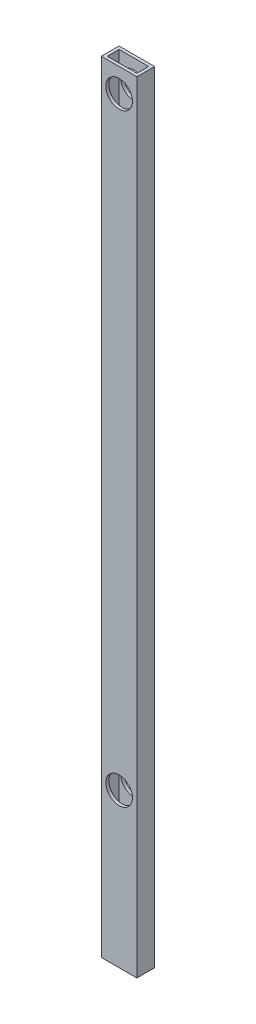
ISO-10303-21;
HEADER;
FILE_DESCRIPTION(('STEP AP214'),'2;1');
FILE_NAME('part.step','',(''),(''),'','','');
FILE_SCHEMA(('AUTOMOTIVE_DESIGN { 1 0 10303 214 1 1 1 1 }'));
ENDSEC;
DATA;
#1=APPLICATION_CONTEXT('core data for automotive mechanical design processes');
#2=APPLICATION_PROTOCOL_DEFINITION('international standard','automotive_design',2000,#1);
#3=PRODUCT_CONTEXT('',#1,'mechanical');
#4=PRODUCT('Part','Part','',(#3));
#5=PRODUCT_RELATED_PRODUCT_CATEGORY('part','',(#4));
#6=PRODUCT_DEFINITION_FORMATION('','',#4);
#7=PRODUCT_DEFINITION_CONTEXT('part definition',#1,'design');
#8=PRODUCT_DEFINITION('design','',#6,#7);
#9=PRODUCT_DEFINITION_SHAPE('','',#8);
#10=(LENGTH_UNIT() NAMED_UNIT(*) SI_UNIT(.MILLI.,.METRE.));
#11=(NAMED_UNIT(*) PLANE_ANGLE_UNIT() SI_UNIT($,.RADIAN.));
#12=(NAMED_UNIT(*) SI_UNIT($,.STERADIAN.) SOLID_ANGLE_UNIT());
#13=UNCERTAINTY_MEASURE_WITH_UNIT(LENGTH_MEASURE(1.E-05),#10,'distance_accuracy_value','');
#14=(GEOMETRIC_REPRESENTATION_CONTEXT(3) GLOBAL_UNCERTAINTY_ASSIGNED_CONTEXT((#13)) GLOBAL_UNIT_ASSIGNED_CONTEXT((#10,
#11,#12)) REPRESENTATION_CONTEXT('',''));
#15=CARTESIAN_POINT('',(0.,0.,0.));
#16=DIRECTION('',(0.,0.,1.));
#17=DIRECTION('',(1.,0.,0.));
#18=AXIS2_PLACEMENT_3D('',#15,#16,#17);
#19=CARTESIAN_POINT('',(0.,838.2,0.));
#20=DIRECTION('',(-1.,0.,0.));
#21=DIRECTION('',(0.,0.,1.));
#22=AXIS2_PLACEMENT_3D('',#19,#20,#21);
#23=PLANE('',#22);
#24=DIRECTION('',(0.,0.,-1.));
#25=VECTOR('',#24,1.);
#26=CARTESIAN_POINT('',(0.,0.,0.));
#27=LINE('',#26,#25);
#28=CARTESIAN_POINT('',(0.,0.,0.));
#29=VERTEX_POINT('',#28);
#30=CARTESIAN_POINT('',(0.,0.,-19.05));
#31=VERTEX_POINT('',#30);
#32=EDGE_CURVE('E156',#29,#31,#27,.T.);
#33=ORIENTED_EDGE('',*,*,#32,.F.);
#34=DIRECTION('',(0.,-1.,0.));
#35=VECTOR('',#34,1.);
#36=CARTESIAN_POINT('',(0.,838.2,0.));
#37=LINE('',#36,#35);
#38=CARTESIAN_POINT('',(0.,838.2,0.));
#39=VERTEX_POINT('',#38);
#40=EDGE_CURVE('E12',#39,#29,#37,.T.);
#41=ORIENTED_EDGE('',*,*,#40,.F.);
#42=DIRECTION('',(0.,0.,-1.));
#43=VECTOR('',#42,1.);
#44=CARTESIAN_POINT('',(0.,838.2,0.));
#45=LINE('',#44,#43);
#46=CARTESIAN_POINT('',(0.,838.2,-19.05));
#47=VERTEX_POINT('',#46);
#48=EDGE_CURVE('E160',#39,#47,#45,.T.);
#49=ORIENTED_EDGE('',*,*,#48,.T.);
#50=DIRECTION('',(0.,-1.,0.));
#51=VECTOR('',#50,1.);
#52=CARTESIAN_POINT('',(0.,838.2,-19.05));
#53=LINE('',#52,#51);
#54=EDGE_CURVE('E171',#47,#31,#53,.T.);
#55=ORIENTED_EDGE('',*,*,#54,.T.);
#56=EDGE_LOOP('',(#33,#41,#49,#55));
#57=FACE_BOUND('',#56,.T.);
#58=ADVANCED_FACE('F57',(#57),#23,.T.);
#59=CARTESIAN_POINT('',(0.,838.2,0.));
#60=DIRECTION('',(0.,0.,-1.));
#61=DIRECTION('',(-1.,0.,0.));
#62=AXIS2_PLACEMENT_3D('',#59,#60,#61);
#63=PLANE('',#62);
#64=CARTESIAN_POINT('',(19.05,812.8,0.));
#65=DIRECTION('',(0.,0.,1.));
#66=DIRECTION('',(1.,0.,0.));
#67=AXIS2_PLACEMENT_3D('',#64,#65,#66);
#68=CIRCLE('',#67,14.2875);
#69=CARTESIAN_POINT('',(33.3375,812.8,0.));
#70=VERTEX_POINT('',#69);
#71=EDGE_CURVE('E201',#70,#70,#68,.T.);
#72=ORIENTED_EDGE('',*,*,#71,.F.);
#73=EDGE_LOOP('',(#72));
#74=FACE_BOUND('',#73,.T.);
#75=CARTESIAN_POINT('',(19.05,165.1,0.));
#76=DIRECTION('',(0.,0.,1.));
#77=DIRECTION('',(1.,0.,0.));
#78=AXIS2_PLACEMENT_3D('',#75,#76,#77);
#79=CIRCLE('',#78,14.2875);
#80=CARTESIAN_POINT('',(33.3375,165.1,0.));
#81=VERTEX_POINT('',#80);
#82=EDGE_CURVE('E192',#81,#81,#79,.T.);
#83=ORIENTED_EDGE('',*,*,#82,.F.);
#84=EDGE_LOOP('',(#83));
#85=FACE_BOUND('',#84,.T.);
#86=DIRECTION('',(1.,0.,0.));
#87=VECTOR('',#86,1.);
#88=CARTESIAN_POINT('',(0.,0.,0.));
#89=LINE('',#88,#87);
#90=CARTESIAN_POINT('',(38.1,0.,0.));
#91=VERTEX_POINT('',#90);
#92=EDGE_CURVE('E164',#29,#91,#89,.T.);
#93=ORIENTED_EDGE('',*,*,#92,.T.);
#94=DIRECTION('',(0.,-1.,0.));
#95=VECTOR('',#94,1.);
#96=CARTESIAN_POINT('',(38.1,838.2,0.));
#97=LINE('',#96,#95);
#98=CARTESIAN_POINT('',(38.1,838.2,0.));
#99=VERTEX_POINT('',#98);
#100=EDGE_CURVE('E65',#99,#91,#97,.T.);
#101=ORIENTED_EDGE('',*,*,#100,.F.);
#102=DIRECTION('',(1.,0.,0.));
#103=VECTOR('',#102,1.);
#104=CARTESIAN_POINT('',(0.,838.2,0.));
#105=LINE('',#104,#103);
#106=EDGE_CURVE('E169',#39,#99,#105,.T.);
#107=ORIENTED_EDGE('',*,*,#106,.F.);
#108=ORIENTED_EDGE('',*,*,#40,.T.);
#109=EDGE_LOOP('',(#93,#101,#107,#108));
#110=FACE_BOUND('',#109,.T.);
#111=ADVANCED_FACE('F227',(#74,#85,#110),#63,.F.);
#112=CARTESIAN_POINT('',(38.1,838.2,0.));
#113=DIRECTION('',(-1.,0.,0.));
#114=DIRECTION('',(0.,0.,1.));
#115=AXIS2_PLACEMENT_3D('',#112,#113,#114);
#116=PLANE('',#115);
#117=DIRECTION('',(0.,0.,-1.));
#118=VECTOR('',#117,1.);
#119=CARTESIAN_POINT('',(38.1,0.,0.));
#120=LINE('',#119,#118);
#121=CARTESIAN_POINT('',(38.1,0.,-19.05));
#122=VERTEX_POINT('',#121);
#123=EDGE_CURVE('E177',#91,#122,#120,.T.);
#124=ORIENTED_EDGE('',*,*,#123,.T.);
#125=DIRECTION('',(0.,-1.,0.));
#126=VECTOR('',#125,1.);
#127=CARTESIAN_POINT('',(38.1,838.2,-19.05));
#128=LINE('',#127,#126);
#129=CARTESIAN_POINT('',(38.1,838.2,-19.05));
#130=VERTEX_POINT('',#129);
#131=EDGE_CURVE('E183',#130,#122,#128,.T.);
#132=ORIENTED_EDGE('',*,*,#131,.F.);
#133=DIRECTION('',(0.,0.,-1.));
#134=VECTOR('',#133,1.);
#135=CARTESIAN_POINT('',(38.1,838.2,0.));
#136=LINE('',#135,#134);
#137=EDGE_CURVE('E167',#99,#130,#136,.T.);
#138=ORIENTED_EDGE('',*,*,#137,.F.);
#139=ORIENTED_EDGE('',*,*,#100,.T.);
#140=EDGE_LOOP('',(#124,#132,#138,#139));
#141=FACE_BOUND('',#140,.T.);
#142=ADVANCED_FACE('F233',(#141),#116,.F.);
#143=CARTESIAN_POINT('',(0.,838.2,-19.05));
#144=DIRECTION('',(0.,0.,-1.));
#145=DIRECTION('',(-1.,0.,0.));
#146=AXIS2_PLACEMENT_3D('',#143,#144,#145);
#147=PLANE('',#146);
#148=CARTESIAN_POINT('',(19.05,812.8,-19.05));
#149=DIRECTION('',(0.,0.,1.));
#150=DIRECTION('',(1.,0.,0.));
#151=AXIS2_PLACEMENT_3D('',#148,#149,#150);
#152=CIRCLE('',#151,14.2875);
#153=CARTESIAN_POINT('',(33.3375,812.8,-19.05));
#154=VERTEX_POINT('',#153);
#155=EDGE_CURVE('E204',#154,#154,#152,.T.);
#156=ORIENTED_EDGE('',*,*,#155,.T.);
#157=EDGE_LOOP('',(#156));
#158=FACE_BOUND('',#157,.T.);
#159=CARTESIAN_POINT('',(19.05,165.1,-19.05));
#160=DIRECTION('',(0.,0.,1.));
#161=DIRECTION('',(1.,0.,0.));
#162=AXIS2_PLACEMENT_3D('',#159,#160,#161);
#163=CIRCLE('',#162,14.2875);
#164=CARTESIAN_POINT('',(33.3375,165.1,-19.05));
#165=VERTEX_POINT('',#164);
#166=EDGE_CURVE('E187',#165,#165,#163,.T.);
#167=ORIENTED_EDGE('',*,*,#166,.T.);
#168=EDGE_LOOP('',(#167));
#169=FACE_BOUND('',#168,.T.);
#170=DIRECTION('',(1.,0.,0.));
#171=VECTOR('',#170,1.);
#172=CARTESIAN_POINT('',(0.,0.,-19.05));
#173=LINE('',#172,#171);
#174=EDGE_CURVE('E174',#31,#122,#173,.T.);
#175=ORIENTED_EDGE('',*,*,#174,.F.);
#176=ORIENTED_EDGE('',*,*,#54,.F.);
#177=DIRECTION('',(1.,0.,0.));
#178=VECTOR('',#177,1.);
#179=CARTESIAN_POINT('',(0.,838.2,-19.05));
#180=LINE('',#179,#178);
#181=EDGE_CURVE('E163',#47,#130,#180,.T.);
#182=ORIENTED_EDGE('',*,*,#181,.T.);
#183=ORIENTED_EDGE('',*,*,#131,.T.);
#184=EDGE_LOOP('',(#175,#176,#182,#183));
#185=FACE_BOUND('',#184,.T.);
#186=ADVANCED_FACE('F251',(#158,#169,#185),#147,.T.);
#187=CARTESIAN_POINT('',(0.,838.2,0.));
#188=DIRECTION('',(0.,-1.,0.));
#189=DIRECTION('',(0.,0.,-1.));
#190=AXIS2_PLACEMENT_3D('',#187,#188,#189);
#191=PLANE('',#190);
#192=DIRECTION('',(1.,0.,0.));
#193=VECTOR('',#192,1.);
#194=CARTESIAN_POINT('',(0.,838.2,-3.175));
#195=LINE('',#194,#193);
#196=CARTESIAN_POINT('',(3.175,838.2,-3.175));
#197=VERTEX_POINT('',#196);
#198=CARTESIAN_POINT('',(34.925,838.2,-3.175));
#199=VERTEX_POINT('',#198);
#200=EDGE_CURVE('E127',#197,#199,#195,.T.);
#201=ORIENTED_EDGE('',*,*,#200,.F.);
#202=DIRECTION('',(0.,0.,-1.));
#203=VECTOR('',#202,1.);
#204=CARTESIAN_POINT('',(3.175,838.2,0.));
#205=LINE('',#204,#203);
#206=CARTESIAN_POINT('',(3.175,838.2,-15.875));
#207=VERTEX_POINT('',#206);
#208=EDGE_CURVE('E124',#197,#207,#205,.T.);
#209=ORIENTED_EDGE('',*,*,#208,.T.);
#210=DIRECTION('',(1.,0.,0.));
#211=VECTOR('',#210,1.);
#212=CARTESIAN_POINT('',(0.,838.2,-15.875));
#213=LINE('',#212,#211);
#214=CARTESIAN_POINT('',(34.925,838.2,-15.875));
#215=VERTEX_POINT('',#214);
#216=EDGE_CURVE('E130',#207,#215,#213,.T.);
#217=ORIENTED_EDGE('',*,*,#216,.T.);
#218=DIRECTION('',(0.,0.,-1.));
#219=VECTOR('',#218,1.);
#220=CARTESIAN_POINT('',(34.925,838.2,0.));
#221=LINE('',#220,#219);
#222=EDGE_CURVE('E134',#199,#215,#221,.T.);
#223=ORIENTED_EDGE('',*,*,#222,.F.);
#224=EDGE_LOOP('',(#201,#209,#217,#223));
#225=FACE_BOUND('',#224,.T.);
#226=ORIENTED_EDGE('',*,*,#48,.F.);
#227=ORIENTED_EDGE('',*,*,#106,.T.);
#228=ORIENTED_EDGE('',*,*,#137,.T.);
#229=ORIENTED_EDGE('',*,*,#181,.F.);
#230=EDGE_LOOP('',(#226,#227,#228,#229));
#231=FACE_BOUND('',#230,.T.);
#232=ADVANCED_FACE('F136',(#225,#231),#191,.F.);
#233=CARTESIAN_POINT('',(0.,0.,0.));
#234=DIRECTION('',(0.,-1.,0.));
#235=DIRECTION('',(0.,0.,-1.));
#236=AXIS2_PLACEMENT_3D('',#233,#234,#235);
#237=PLANE('',#236);
#238=DIRECTION('',(0.,0.,-1.));
#239=VECTOR('',#238,1.);
#240=CARTESIAN_POINT('',(3.175,0.,0.));
#241=LINE('',#240,#239);
#242=CARTESIAN_POINT('',(3.175,0.,-3.175));
#243=VERTEX_POINT('',#242);
#244=CARTESIAN_POINT('',(3.175,0.,-15.875));
#245=VERTEX_POINT('',#244);
#246=EDGE_CURVE('E81',#243,#245,#241,.T.);
#247=ORIENTED_EDGE('',*,*,#246,.F.);
#248=DIRECTION('',(1.,0.,0.));
#249=VECTOR('',#248,1.);
#250=CARTESIAN_POINT('',(0.,0.,-3.175));
#251=LINE('',#250,#249);
#252=CARTESIAN_POINT('',(34.925,0.,-3.175));
#253=VERTEX_POINT('',#252);
#254=EDGE_CURVE('E138',#243,#253,#251,.T.);
#255=ORIENTED_EDGE('',*,*,#254,.T.);
#256=DIRECTION('',(0.,0.,-1.));
#257=VECTOR('',#256,1.);
#258=CARTESIAN_POINT('',(34.925,0.,0.));
#259=LINE('',#258,#257);
#260=CARTESIAN_POINT('',(34.925,0.,-15.875));
#261=VERTEX_POINT('',#260);
#262=EDGE_CURVE('E141',#253,#261,#259,.T.);
#263=ORIENTED_EDGE('',*,*,#262,.T.);
#264=DIRECTION('',(1.,0.,0.));
#265=VECTOR('',#264,1.);
#266=CARTESIAN_POINT('',(0.,0.,-15.875));
#267=LINE('',#266,#265);
#268=EDGE_CURVE('E150',#245,#261,#267,.T.);
#269=ORIENTED_EDGE('',*,*,#268,.F.);
#270=EDGE_LOOP('',(#247,#255,#263,#269));
#271=FACE_BOUND('',#270,.T.);
#272=ORIENTED_EDGE('',*,*,#32,.T.);
#273=ORIENTED_EDGE('',*,*,#174,.T.);
#274=ORIENTED_EDGE('',*,*,#123,.F.);
#275=ORIENTED_EDGE('',*,*,#92,.F.);
#276=EDGE_LOOP('',(#272,#273,#274,#275));
#277=FACE_BOUND('',#276,.T.);
#278=ADVANCED_FACE('F241',(#271,#277),#237,.T.);
#279=CARTESIAN_POINT('',(3.175,838.2,0.));
#280=DIRECTION('',(-1.,0.,0.));
#281=DIRECTION('',(0.,0.,1.));
#282=AXIS2_PLACEMENT_3D('',#279,#280,#281);
#283=PLANE('',#282);
#284=ORIENTED_EDGE('',*,*,#246,.T.);
#285=DIRECTION('',(0.,-1.,0.));
#286=VECTOR('',#285,1.);
#287=CARTESIAN_POINT('',(3.175,838.2,-15.875));
#288=LINE('',#287,#286);
#289=EDGE_CURVE('E121',#207,#245,#288,.T.);
#290=ORIENTED_EDGE('',*,*,#289,.F.);
#291=ORIENTED_EDGE('',*,*,#208,.F.);
#292=DIRECTION('',(0.,-1.,0.));
#293=VECTOR('',#292,1.);
#294=CARTESIAN_POINT('',(3.175,838.2,-3.175));
#295=LINE('',#294,#293);
#296=EDGE_CURVE('E154',#197,#243,#295,.T.);
#297=ORIENTED_EDGE('',*,*,#296,.T.);
#298=EDGE_LOOP('',(#284,#290,#291,#297));
#299=FACE_BOUND('',#298,.T.);
#300=ADVANCED_FACE('F122',(#299),#283,.F.);
#301=CARTESIAN_POINT('',(0.,838.2,-3.175));
#302=DIRECTION('',(0.,0.,-1.));
#303=DIRECTION('',(-1.,0.,0.));
#304=AXIS2_PLACEMENT_3D('',#301,#302,#303);
#305=PLANE('',#304);
#306=CARTESIAN_POINT('',(19.05,812.8,-3.175));
#307=DIRECTION('',(0.,0.,-1.));
#308=DIRECTION('',(-1.,0.,0.));
#309=AXIS2_PLACEMENT_3D('',#306,#307,#308);
#310=CIRCLE('',#309,14.2875);
#311=CARTESIAN_POINT('',(33.3375,812.8,-3.175));
#312=VERTEX_POINT('',#311);
#313=EDGE_CURVE('E197',#312,#312,#310,.T.);
#314=ORIENTED_EDGE('',*,*,#313,.F.);
#315=EDGE_LOOP('',(#314));
#316=FACE_BOUND('',#315,.T.);
#317=CARTESIAN_POINT('',(19.05,165.1,-3.175));
#318=DIRECTION('',(0.,0.,-1.));
#319=DIRECTION('',(-1.,0.,0.));
#320=AXIS2_PLACEMENT_3D('',#317,#318,#319);
#321=CIRCLE('',#320,14.2875);
#322=CARTESIAN_POINT('',(33.3375,165.1,-3.175));
#323=VERTEX_POINT('',#322);
#324=EDGE_CURVE('E144',#323,#323,#321,.T.);
#325=ORIENTED_EDGE('',*,*,#324,.F.);
#326=EDGE_LOOP('',(#325));
#327=FACE_BOUND('',#326,.T.);
#328=ORIENTED_EDGE('',*,*,#254,.F.);
#329=ORIENTED_EDGE('',*,*,#296,.F.);
#330=ORIENTED_EDGE('',*,*,#200,.T.);
#331=DIRECTION('',(0.,-1.,0.));
#332=VECTOR('',#331,1.);
#333=CARTESIAN_POINT('',(34.925,838.2,-3.175));
#334=LINE('',#333,#332);
#335=EDGE_CURVE('E157',#199,#253,#334,.T.);
#336=ORIENTED_EDGE('',*,*,#335,.T.);
#337=EDGE_LOOP('',(#328,#329,#330,#336));
#338=FACE_BOUND('',#337,.T.);
#339=ADVANCED_FACE('F266',(#316,#327,#338),#305,.T.);
#340=CARTESIAN_POINT('',(34.925,838.2,0.));
#341=DIRECTION('',(-1.,0.,0.));
#342=DIRECTION('',(0.,0.,1.));
#343=AXIS2_PLACEMENT_3D('',#340,#341,#342);
#344=PLANE('',#343);
#345=ORIENTED_EDGE('',*,*,#262,.F.);
#346=ORIENTED_EDGE('',*,*,#335,.F.);
#347=ORIENTED_EDGE('',*,*,#222,.T.);
#348=DIRECTION('',(0.,-1.,0.));
#349=VECTOR('',#348,1.);
#350=CARTESIAN_POINT('',(34.925,838.2,-15.875));
#351=LINE('',#350,#349);
#352=EDGE_CURVE('E73',#215,#261,#351,.T.);
#353=ORIENTED_EDGE('',*,*,#352,.T.);
#354=EDGE_LOOP('',(#345,#346,#347,#353));
#355=FACE_BOUND('',#354,.T.);
#356=ADVANCED_FACE('F269',(#355),#344,.T.);
#357=CARTESIAN_POINT('',(0.,838.2,-15.875));
#358=DIRECTION('',(0.,0.,-1.));
#359=DIRECTION('',(-1.,0.,0.));
#360=AXIS2_PLACEMENT_3D('',#357,#358,#359);
#361=PLANE('',#360);
#362=CARTESIAN_POINT('',(19.05,812.8,-15.875));
#363=DIRECTION('',(0.,0.,-1.));
#364=DIRECTION('',(-1.,0.,0.));
#365=AXIS2_PLACEMENT_3D('',#362,#363,#364);
#366=CIRCLE('',#365,14.2875);
#367=CARTESIAN_POINT('',(33.3375,812.8,-15.875));
#368=VERTEX_POINT('',#367);
#369=EDGE_CURVE('E60',#368,#368,#366,.T.);
#370=ORIENTED_EDGE('',*,*,#369,.T.);
#371=EDGE_LOOP('',(#370));
#372=FACE_BOUND('',#371,.T.);
#373=CARTESIAN_POINT('',(19.05,165.1,-15.875));
#374=DIRECTION('',(0.,0.,-1.));
#375=DIRECTION('',(-1.,0.,0.));
#376=AXIS2_PLACEMENT_3D('',#373,#374,#375);
#377=CIRCLE('',#376,14.2875);
#378=CARTESIAN_POINT('',(33.3375,165.1,-15.875));
#379=VERTEX_POINT('',#378);
#380=EDGE_CURVE('E185',#379,#379,#377,.T.);
#381=ORIENTED_EDGE('',*,*,#380,.T.);
#382=EDGE_LOOP('',(#381));
#383=FACE_BOUND('',#382,.T.);
#384=ORIENTED_EDGE('',*,*,#268,.T.);
#385=ORIENTED_EDGE('',*,*,#352,.F.);
#386=ORIENTED_EDGE('',*,*,#216,.F.);
#387=ORIENTED_EDGE('',*,*,#289,.T.);
#388=EDGE_LOOP('',(#384,#385,#386,#387));
#389=FACE_BOUND('',#388,.T.);
#390=ADVANCED_FACE('F131',(#372,#383,#389),#361,.F.);
#391=CARTESIAN_POINT('',(19.05,165.1,-19.05));
#392=DIRECTION('',(0.,0.,1.));
#393=DIRECTION('',(1.,0.,0.));
#394=AXIS2_PLACEMENT_3D('',#391,#392,#393);
#395=CYLINDRICAL_SURFACE('',#394,14.2875);
#396=CARTESIAN_POINT('',(33.3375,165.1,-19.05));
#397=CARTESIAN_POINT('',(33.3375,165.1,-19.0169270833333));
#398=CARTESIAN_POINT('',(33.3375,165.1,-18.9838541666667));
#399=CARTESIAN_POINT('',(33.3375,165.1,-18.9177083333333));
#400=CARTESIAN_POINT('',(33.3375,165.1,-18.8846354166667));
#401=CARTESIAN_POINT('',(33.3375,165.1,-18.8184895833333));
#402=CARTESIAN_POINT('',(33.3375,165.1,-18.7854166666667));
#403=CARTESIAN_POINT('',(33.3375,165.1,-18.7192708333333));
#404=CARTESIAN_POINT('',(33.3375,165.1,-18.6861979166667));
#405=CARTESIAN_POINT('',(33.3375,165.1,-18.6200520833333));
#406=CARTESIAN_POINT('',(33.3375,165.1,-18.5869791666667));
#407=CARTESIAN_POINT('',(33.3375,165.1,-18.5208333333333));
#408=CARTESIAN_POINT('',(33.3375,165.1,-18.4877604166667));
#409=CARTESIAN_POINT('',(33.3375,165.1,-18.4216145833333));
#410=CARTESIAN_POINT('',(33.3375,165.1,-18.3885416666667));
#411=CARTESIAN_POINT('',(33.3375,165.1,-18.3223958333333));
#412=CARTESIAN_POINT('',(33.3375,165.1,-18.2893229166667));
#413=CARTESIAN_POINT('',(33.3375,165.1,-18.2231770833333));
#414=CARTESIAN_POINT('',(33.3375,165.1,-18.1901041666667));
#415=CARTESIAN_POINT('',(33.3375,165.1,-18.1239583333333));
#416=CARTESIAN_POINT('',(33.3375,165.1,-18.0908854166667));
#417=CARTESIAN_POINT('',(33.3375,165.1,-18.0247395833333));
#418=CARTESIAN_POINT('',(33.3375,165.1,-17.9916666666667));
#419=CARTESIAN_POINT('',(33.3375,165.1,-17.9255208333333));
#420=CARTESIAN_POINT('',(33.3375,165.1,-17.8924479166667));
#421=CARTESIAN_POINT('',(33.3375,165.1,-17.8263020833333));
#422=CARTESIAN_POINT('',(33.3375,165.1,-17.7932291666667));
#423=CARTESIAN_POINT('',(33.3375,165.1,-17.7270833333333));
#424=CARTESIAN_POINT('',(33.3375,165.1,-17.6940104166667));
#425=CARTESIAN_POINT('',(33.3375,165.1,-17.6278645833333));
#426=CARTESIAN_POINT('',(33.3375,165.1,-17.5947916666667));
#427=CARTESIAN_POINT('',(33.3375,165.1,-17.5286458333333));
#428=CARTESIAN_POINT('',(33.3375,165.1,-17.4955729166667));
#429=CARTESIAN_POINT('',(33.3375,165.1,-17.4294270833333));
#430=CARTESIAN_POINT('',(33.3375,165.1,-17.3963541666667));
#431=CARTESIAN_POINT('',(33.3375,165.1,-17.3302083333333));
#432=CARTESIAN_POINT('',(33.3375,165.1,-17.2971354166667));
#433=CARTESIAN_POINT('',(33.3375,165.1,-17.2309895833333));
#434=CARTESIAN_POINT('',(33.3375,165.1,-17.1979166666667));
#435=CARTESIAN_POINT('',(33.3375,165.1,-17.1317708333333));
#436=CARTESIAN_POINT('',(33.3375,165.1,-17.0986979166667));
#437=CARTESIAN_POINT('',(33.3375,165.1,-17.0325520833333));
#438=CARTESIAN_POINT('',(33.3375,165.1,-16.9994791666667));
#439=CARTESIAN_POINT('',(33.3375,165.1,-16.9333333333333));
#440=CARTESIAN_POINT('',(33.3375,165.1,-16.9002604166667));
#441=CARTESIAN_POINT('',(33.3375,165.1,-16.8341145833333));
#442=CARTESIAN_POINT('',(33.3375,165.1,-16.8010416666667));
#443=CARTESIAN_POINT('',(33.3375,165.1,-16.7348958333333));
#444=CARTESIAN_POINT('',(33.3375,165.1,-16.7018229166667));
#445=CARTESIAN_POINT('',(33.3375,165.1,-16.6356770833333));
#446=CARTESIAN_POINT('',(33.3375,165.1,-16.6026041666667));
#447=CARTESIAN_POINT('',(33.3375,165.1,-16.5364583333333));
#448=CARTESIAN_POINT('',(33.3375,165.1,-16.5033854166667));
#449=CARTESIAN_POINT('',(33.3375,165.1,-16.4372395833333));
#450=CARTESIAN_POINT('',(33.3375,165.1,-16.4041666666667));
#451=CARTESIAN_POINT('',(33.3375,165.1,-16.3380208333333));
#452=CARTESIAN_POINT('',(33.3375,165.1,-16.3049479166667));
#453=CARTESIAN_POINT('',(33.3375,165.1,-16.2388020833333));
#454=CARTESIAN_POINT('',(33.3375,165.1,-16.2057291666667));
#455=CARTESIAN_POINT('',(33.3375,165.1,-16.1395833333333));
#456=CARTESIAN_POINT('',(33.3375,165.1,-16.1065104166667));
#457=CARTESIAN_POINT('',(33.3375,165.1,-16.0403645833333));
#458=CARTESIAN_POINT('',(33.3375,165.1,-16.0072916666667));
#459=CARTESIAN_POINT('',(33.3375,165.1,-15.9411458333333));
#460=CARTESIAN_POINT('',(33.3375,165.1,-15.9080729166667));
#461=CARTESIAN_POINT('',(33.3375,165.1,-15.875));
#462=B_SPLINE_CURVE_WITH_KNOTS('',3,(#396,#397,#398,#399,#400,#401,#402,#403,#404,#405,#406,
#407,#408,#409,#410,#411,#412,#413,#414,#415,#416,#417,#418,#419,#420,#421,#422,#423,#424,#425,
#426,#427,#428,#429,#430,#431,#432,#433,#434,#435,#436,#437,#438,#439,#440,#441,#442,#443,#444,
#445,#446,#447,#448,#449,#450,#451,#452,#453,#454,#455,#456,#457,#458,#459,#460,#461),
.UNSPECIFIED.,.F.,.F.,(4,2,2,2,2,2,2,2,2,2,2,2,2,2,2,2,2,2,2,2,2,2,2,2,2,2,2,2,2,2,2,2,4),(0.,
0.0992187499999977,0.198437499999999,0.29765625,0.396874999999998,0.496093749999999,0.5953125,
0.694531249999998,0.793749999999999,0.892968750000001,0.992187499999998,1.09140625,1.190625,
1.28984375,1.3890625,1.48828125,1.5875,1.68671875,1.7859375,1.88515625,1.984375,2.08359375,
2.1828125,2.28203125,2.38125,2.48046875,2.5796875,2.67890625,2.778125,2.87734375,2.9765625,
3.07578125,3.175),.UNSPECIFIED.);
#463=EDGE_CURVE('BSEAM223',#165,#379,#462,.T.);
#464=ORIENTED_EDGE('',*,*,#166,.F.);
#465=ORIENTED_EDGE('',*,*,#380,.F.);
#466=ORIENTED_EDGE('',*,*,#463,.T.);
#467=ORIENTED_EDGE('',*,*,#463,.F.);
#468=EDGE_LOOP('',(#464,#466,#465,#467));
#469=FACE_BOUND('',#468,.T.);
#470=ADVANCED_FACE('F223',(#469),#395,.F.);
#471=CARTESIAN_POINT('',(33.3375,165.1,-3.175));
#472=CARTESIAN_POINT('',(33.3375,165.1,-3.14192708333333));
#473=CARTESIAN_POINT('',(33.3375,165.1,-3.10885416666666));
#474=CARTESIAN_POINT('',(33.3375,165.1,-3.04270833333333));
#475=CARTESIAN_POINT('',(33.3375,165.1,-3.00963541666666));
#476=CARTESIAN_POINT('',(33.3375,165.1,-2.94348958333333));
#477=CARTESIAN_POINT('',(33.3375,165.1,-2.91041666666666));
#478=CARTESIAN_POINT('',(33.3375,165.1,-2.84427083333333));
#479=CARTESIAN_POINT('',(33.3375,165.1,-2.81119791666667));
#480=CARTESIAN_POINT('',(33.3375,165.1,-2.74505208333333));
#481=CARTESIAN_POINT('',(33.3375,165.1,-2.71197916666667));
#482=CARTESIAN_POINT('',(33.3375,165.1,-2.64583333333333));
#483=CARTESIAN_POINT('',(33.3375,165.1,-2.61276041666666));
#484=CARTESIAN_POINT('',(33.3375,165.1,-2.54661458333333));
#485=CARTESIAN_POINT('',(33.3375,165.1,-2.51354166666667));
#486=CARTESIAN_POINT('',(33.3375,165.1,-2.44739583333333));
#487=CARTESIAN_POINT('',(33.3375,165.1,-2.41432291666667));
#488=CARTESIAN_POINT('',(33.3375,165.1,-2.34817708333333));
#489=CARTESIAN_POINT('',(33.3375,165.1,-2.31510416666666));
#490=CARTESIAN_POINT('',(33.3375,165.1,-2.24895833333333));
#491=CARTESIAN_POINT('',(33.3375,165.1,-2.21588541666666));
#492=CARTESIAN_POINT('',(33.3375,165.1,-2.14973958333333));
#493=CARTESIAN_POINT('',(33.3375,165.1,-2.11666666666666));
#494=CARTESIAN_POINT('',(33.3375,165.1,-2.05052083333333));
#495=CARTESIAN_POINT('',(33.3375,165.1,-2.01744791666666));
#496=CARTESIAN_POINT('',(33.3375,165.1,-1.95130208333333));
#497=CARTESIAN_POINT('',(33.3375,165.1,-1.91822916666666));
#498=CARTESIAN_POINT('',(33.3375,165.1,-1.85208333333333));
#499=CARTESIAN_POINT('',(33.3375,165.1,-1.81901041666666));
#500=CARTESIAN_POINT('',(33.3375,165.1,-1.75286458333333));
#501=CARTESIAN_POINT('',(33.3375,165.1,-1.71979166666667));
#502=CARTESIAN_POINT('',(33.3375,165.1,-1.65364583333333));
#503=CARTESIAN_POINT('',(33.3375,165.1,-1.62057291666667));
#504=CARTESIAN_POINT('',(33.3375,165.1,-1.55442708333333));
#505=CARTESIAN_POINT('',(33.3375,165.1,-1.52135416666666));
#506=CARTESIAN_POINT('',(33.3375,165.1,-1.45520833333333));
#507=CARTESIAN_POINT('',(33.3375,165.1,-1.42213541666667));
#508=CARTESIAN_POINT('',(33.3375,165.1,-1.35598958333333));
#509=CARTESIAN_POINT('',(33.3375,165.1,-1.32291666666667));
#510=CARTESIAN_POINT('',(33.3375,165.1,-1.25677083333333));
#511=CARTESIAN_POINT('',(33.3375,165.1,-1.22369791666667));
#512=CARTESIAN_POINT('',(33.3375,165.1,-1.15755208333333));
#513=CARTESIAN_POINT('',(33.3375,165.1,-1.12447916666667));
#514=CARTESIAN_POINT('',(33.3375,165.1,-1.05833333333333));
#515=CARTESIAN_POINT('',(33.3375,165.1,-1.02526041666667));
#516=CARTESIAN_POINT('',(33.3375,165.1,-0.959114583333332));
#517=CARTESIAN_POINT('',(33.3375,165.1,-0.926041666666666));
#518=CARTESIAN_POINT('',(33.3375,165.1,-0.859895833333334));
#519=CARTESIAN_POINT('',(33.3375,165.1,-0.826822916666666));
#520=CARTESIAN_POINT('',(33.3375,165.1,-0.760677083333332));
#521=CARTESIAN_POINT('',(33.3375,165.1,-0.727604166666665));
#522=CARTESIAN_POINT('',(33.3375,165.1,-0.661458333333332));
#523=CARTESIAN_POINT('',(33.3375,165.1,-0.628385416666666));
#524=CARTESIAN_POINT('',(33.3375,165.1,-0.562239583333333));
#525=CARTESIAN_POINT('',(33.3375,165.1,-0.529166666666666));
#526=CARTESIAN_POINT('',(33.3375,165.1,-0.463020833333332));
#527=CARTESIAN_POINT('',(33.3375,165.1,-0.429947916666665));
#528=CARTESIAN_POINT('',(33.3375,165.1,-0.363802083333332));
#529=CARTESIAN_POINT('',(33.3375,165.1,-0.330729166666666));
#530=CARTESIAN_POINT('',(33.3375,165.1,-0.264583333333333));
#531=CARTESIAN_POINT('',(33.3375,165.1,-0.231510416666666));
#532=CARTESIAN_POINT('',(33.3375,165.1,-0.165364583333333));
#533=CARTESIAN_POINT('',(33.3375,165.1,-0.132291666666667));
#534=CARTESIAN_POINT('',(33.3375,165.1,-0.0661458333333342));
#535=CARTESIAN_POINT('',(33.3375,165.1,-0.0330729166666671));
#536=CARTESIAN_POINT('',(33.3375,165.1,0.));
#537=B_SPLINE_CURVE_WITH_KNOTS('',3,(#471,#472,#473,#474,#475,#476,#477,#478,#479,#480,#481,
#482,#483,#484,#485,#486,#487,#488,#489,#490,#491,#492,#493,#494,#495,#496,#497,#498,#499,#500,
#501,#502,#503,#504,#505,#506,#507,#508,#509,#510,#511,#512,#513,#514,#515,#516,#517,#518,#519,
#520,#521,#522,#523,#524,#525,#526,#527,#528,#529,#530,#531,#532,#533,#534,#535,#536),
.UNSPECIFIED.,.F.,.F.,(4,2,2,2,2,2,2,2,2,2,2,2,2,2,2,2,2,2,2,2,2,2,2,2,2,2,2,2,2,2,2,2,4),(0.,
0.0992187500000012,0.198437499999999,0.29765625,0.396874999999998,0.496093749999999,0.5953125,
0.694531249999998,0.793749999999999,0.892968750000001,0.992187499999998,1.09140625,1.190625,
1.28984375,1.3890625,1.48828125,1.5875,1.68671875,1.7859375,1.88515625,1.984375,2.08359375,
2.1828125,2.28203125,2.38125,2.48046875,2.5796875,2.67890625,2.778125,2.87734375,2.9765625,
3.07578125,3.175),.UNSPECIFIED.);
#538=EDGE_CURVE('BSEAM215',#323,#81,#537,.T.);
#539=ORIENTED_EDGE('',*,*,#324,.T.);
#540=ORIENTED_EDGE('',*,*,#82,.T.);
#541=ORIENTED_EDGE('',*,*,#538,.T.);
#542=ORIENTED_EDGE('',*,*,#538,.F.);
#543=EDGE_LOOP('',(#539,#541,#540,#542));
#544=FACE_BOUND('',#543,.T.);
#545=ADVANCED_FACE('F215',(#544),#395,.F.);
#546=CARTESIAN_POINT('',(19.05,812.8,-19.05));
#547=DIRECTION('',(0.,0.,1.));
#548=DIRECTION('',(1.,0.,0.));
#549=AXIS2_PLACEMENT_3D('',#546,#547,#548);
#550=CYLINDRICAL_SURFACE('',#549,14.2875);
#551=CARTESIAN_POINT('',(33.3375,812.8,-19.05));
#552=CARTESIAN_POINT('',(33.3375,812.8,-19.0169270833333));
#553=CARTESIAN_POINT('',(33.3375,812.8,-18.9838541666667));
#554=CARTESIAN_POINT('',(33.3375,812.8,-18.9177083333333));
#555=CARTESIAN_POINT('',(33.3375,812.8,-18.8846354166667));
#556=CARTESIAN_POINT('',(33.3375,812.8,-18.8184895833333));
#557=CARTESIAN_POINT('',(33.3375,812.8,-18.7854166666667));
#558=CARTESIAN_POINT('',(33.3375,812.8,-18.7192708333333));
#559=CARTESIAN_POINT('',(33.3375,812.8,-18.6861979166667));
#560=CARTESIAN_POINT('',(33.3375,812.8,-18.6200520833333));
#561=CARTESIAN_POINT('',(33.3375,812.8,-18.5869791666667));
#562=CARTESIAN_POINT('',(33.3375,812.8,-18.5208333333333));
#563=CARTESIAN_POINT('',(33.3375,812.8,-18.4877604166667));
#564=CARTESIAN_POINT('',(33.3375,812.8,-18.4216145833333));
#565=CARTESIAN_POINT('',(33.3375,812.8,-18.3885416666667));
#566=CARTESIAN_POINT('',(33.3375,812.8,-18.3223958333333));
#567=CARTESIAN_POINT('',(33.3375,812.8,-18.2893229166667));
#568=CARTESIAN_POINT('',(33.3375,812.8,-18.2231770833333));
#569=CARTESIAN_POINT('',(33.3375,812.8,-18.1901041666667));
#570=CARTESIAN_POINT('',(33.3375,812.8,-18.1239583333333));
#571=CARTESIAN_POINT('',(33.3375,812.8,-18.0908854166667));
#572=CARTESIAN_POINT('',(33.3375,812.8,-18.0247395833333));
#573=CARTESIAN_POINT('',(33.3375,812.8,-17.9916666666667));
#574=CARTESIAN_POINT('',(33.3375,812.8,-17.9255208333333));
#575=CARTESIAN_POINT('',(33.3375,812.8,-17.8924479166667));
#576=CARTESIAN_POINT('',(33.3375,812.8,-17.8263020833333));
#577=CARTESIAN_POINT('',(33.3375,812.8,-17.7932291666667));
#578=CARTESIAN_POINT('',(33.3375,812.8,-17.7270833333333));
#579=CARTESIAN_POINT('',(33.3375,812.8,-17.6940104166667));
#580=CARTESIAN_POINT('',(33.3375,812.8,-17.6278645833333));
#581=CARTESIAN_POINT('',(33.3375,812.8,-17.5947916666667));
#582=CARTESIAN_POINT('',(33.3375,812.8,-17.5286458333333));
#583=CARTESIAN_POINT('',(33.3375,812.8,-17.4955729166667));
#584=CARTESIAN_POINT('',(33.3375,812.8,-17.4294270833333));
#585=CARTESIAN_POINT('',(33.3375,812.8,-17.3963541666667));
#586=CARTESIAN_POINT('',(33.3375,812.8,-17.3302083333333));
#587=CARTESIAN_POINT('',(33.3375,812.8,-17.2971354166667));
#588=CARTESIAN_POINT('',(33.3375,812.8,-17.2309895833333));
#589=CARTESIAN_POINT('',(33.3375,812.8,-17.1979166666667));
#590=CARTESIAN_POINT('',(33.3375,812.8,-17.1317708333333));
#591=CARTESIAN_POINT('',(33.3375,812.8,-17.0986979166667));
#592=CARTESIAN_POINT('',(33.3375,812.8,-17.0325520833333));
#593=CARTESIAN_POINT('',(33.3375,812.8,-16.9994791666667));
#594=CARTESIAN_POINT('',(33.3375,812.8,-16.9333333333333));
#595=CARTESIAN_POINT('',(33.3375,812.8,-16.9002604166667));
#596=CARTESIAN_POINT('',(33.3375,812.8,-16.8341145833333));
#597=CARTESIAN_POINT('',(33.3375,812.8,-16.8010416666667));
#598=CARTESIAN_POINT('',(33.3375,812.8,-16.7348958333333));
#599=CARTESIAN_POINT('',(33.3375,812.8,-16.7018229166667));
#600=CARTESIAN_POINT('',(33.3375,812.8,-16.6356770833333));
#601=CARTESIAN_POINT('',(33.3375,812.8,-16.6026041666667));
#602=CARTESIAN_POINT('',(33.3375,812.8,-16.5364583333333));
#603=CARTESIAN_POINT('',(33.3375,812.8,-16.5033854166667));
#604=CARTESIAN_POINT('',(33.3375,812.8,-16.4372395833333));
#605=CARTESIAN_POINT('',(33.3375,812.8,-16.4041666666667));
#606=CARTESIAN_POINT('',(33.3375,812.8,-16.3380208333333));
#607=CARTESIAN_POINT('',(33.3375,812.8,-16.3049479166667));
#608=CARTESIAN_POINT('',(33.3375,812.8,-16.2388020833333));
#609=CARTESIAN_POINT('',(33.3375,812.8,-16.2057291666667));
#610=CARTESIAN_POINT('',(33.3375,812.8,-16.1395833333333));
#611=CARTESIAN_POINT('',(33.3375,812.8,-16.1065104166667));
#612=CARTESIAN_POINT('',(33.3375,812.8,-16.0403645833333));
#613=CARTESIAN_POINT('',(33.3375,812.8,-16.0072916666667));
#614=CARTESIAN_POINT('',(33.3375,812.8,-15.9411458333333));
#615=CARTESIAN_POINT('',(33.3375,812.8,-15.9080729166667));
#616=CARTESIAN_POINT('',(33.3375,812.8,-15.875));
#617=B_SPLINE_CURVE_WITH_KNOTS('',3,(#551,#552,#553,#554,#555,#556,#557,#558,#559,#560,#561,
#562,#563,#564,#565,#566,#567,#568,#569,#570,#571,#572,#573,#574,#575,#576,#577,#578,#579,#580,
#581,#582,#583,#584,#585,#586,#587,#588,#589,#590,#591,#592,#593,#594,#595,#596,#597,#598,#599,
#600,#601,#602,#603,#604,#605,#606,#607,#608,#609,#610,#611,#612,#613,#614,#615,#616),
.UNSPECIFIED.,.F.,.F.,(4,2,2,2,2,2,2,2,2,2,2,2,2,2,2,2,2,2,2,2,2,2,2,2,2,2,2,2,2,2,2,2,4),(0.,
0.0992187499999977,0.198437499999999,0.29765625,0.396874999999998,0.496093749999999,0.5953125,
0.694531249999998,0.793749999999999,0.892968750000001,0.992187499999998,1.09140625,1.190625,
1.28984375,1.3890625,1.48828125,1.5875,1.68671875,1.7859375,1.88515625,1.984375,2.08359375,
2.1828125,2.28203125,2.38125,2.48046875,2.5796875,2.67890625,2.778125,2.87734375,2.9765625,
3.07578125,3.175),.UNSPECIFIED.);
#618=EDGE_CURVE('BSEAM212',#154,#368,#617,.T.);
#619=ORIENTED_EDGE('',*,*,#155,.F.);
#620=ORIENTED_EDGE('',*,*,#369,.F.);
#621=ORIENTED_EDGE('',*,*,#618,.T.);
#622=ORIENTED_EDGE('',*,*,#618,.F.);
#623=EDGE_LOOP('',(#619,#621,#620,#622));
#624=FACE_BOUND('',#623,.T.);
#625=ADVANCED_FACE('F212',(#624),#550,.F.);
#626=CARTESIAN_POINT('',(33.3375,812.8,-3.175));
#627=CARTESIAN_POINT('',(33.3375,812.8,-3.14192708333333));
#628=CARTESIAN_POINT('',(33.3375,812.8,-3.10885416666666));
#629=CARTESIAN_POINT('',(33.3375,812.8,-3.04270833333333));
#630=CARTESIAN_POINT('',(33.3375,812.8,-3.00963541666666));
#631=CARTESIAN_POINT('',(33.3375,812.8,-2.94348958333333));
#632=CARTESIAN_POINT('',(33.3375,812.8,-2.91041666666666));
#633=CARTESIAN_POINT('',(33.3375,812.8,-2.84427083333333));
#634=CARTESIAN_POINT('',(33.3375,812.8,-2.81119791666667));
#635=CARTESIAN_POINT('',(33.3375,812.8,-2.74505208333333));
#636=CARTESIAN_POINT('',(33.3375,812.8,-2.71197916666667));
#637=CARTESIAN_POINT('',(33.3375,812.8,-2.64583333333333));
#638=CARTESIAN_POINT('',(33.3375,812.8,-2.61276041666666));
#639=CARTESIAN_POINT('',(33.3375,812.8,-2.54661458333333));
#640=CARTESIAN_POINT('',(33.3375,812.8,-2.51354166666667));
#641=CARTESIAN_POINT('',(33.3375,812.8,-2.44739583333333));
#642=CARTESIAN_POINT('',(33.3375,812.8,-2.41432291666667));
#643=CARTESIAN_POINT('',(33.3375,812.8,-2.34817708333333));
#644=CARTESIAN_POINT('',(33.3375,812.8,-2.31510416666666));
#645=CARTESIAN_POINT('',(33.3375,812.8,-2.24895833333333));
#646=CARTESIAN_POINT('',(33.3375,812.8,-2.21588541666666));
#647=CARTESIAN_POINT('',(33.3375,812.8,-2.14973958333333));
#648=CARTESIAN_POINT('',(33.3375,812.8,-2.11666666666666));
#649=CARTESIAN_POINT('',(33.3375,812.8,-2.05052083333333));
#650=CARTESIAN_POINT('',(33.3375,812.8,-2.01744791666666));
#651=CARTESIAN_POINT('',(33.3375,812.8,-1.95130208333333));
#652=CARTESIAN_POINT('',(33.3375,812.8,-1.91822916666666));
#653=CARTESIAN_POINT('',(33.3375,812.8,-1.85208333333333));
#654=CARTESIAN_POINT('',(33.3375,812.8,-1.81901041666666));
#655=CARTESIAN_POINT('',(33.3375,812.8,-1.75286458333333));
#656=CARTESIAN_POINT('',(33.3375,812.8,-1.71979166666667));
#657=CARTESIAN_POINT('',(33.3375,812.8,-1.65364583333333));
#658=CARTESIAN_POINT('',(33.3375,812.8,-1.62057291666667));
#659=CARTESIAN_POINT('',(33.3375,812.8,-1.55442708333333));
#660=CARTESIAN_POINT('',(33.3375,812.8,-1.52135416666666));
#661=CARTESIAN_POINT('',(33.3375,812.8,-1.45520833333333));
#662=CARTESIAN_POINT('',(33.3375,812.8,-1.42213541666667));
#663=CARTESIAN_POINT('',(33.3375,812.8,-1.35598958333333));
#664=CARTESIAN_POINT('',(33.3375,812.8,-1.32291666666667));
#665=CARTESIAN_POINT('',(33.3375,812.8,-1.25677083333333));
#666=CARTESIAN_POINT('',(33.3375,812.8,-1.22369791666667));
#667=CARTESIAN_POINT('',(33.3375,812.8,-1.15755208333333));
#668=CARTESIAN_POINT('',(33.3375,812.8,-1.12447916666667));
#669=CARTESIAN_POINT('',(33.3375,812.8,-1.05833333333333));
#670=CARTESIAN_POINT('',(33.3375,812.8,-1.02526041666667));
#671=CARTESIAN_POINT('',(33.3375,812.8,-0.959114583333332));
#672=CARTESIAN_POINT('',(33.3375,812.8,-0.926041666666666));
#673=CARTESIAN_POINT('',(33.3375,812.8,-0.859895833333334));
#674=CARTESIAN_POINT('',(33.3375,812.8,-0.826822916666666));
#675=CARTESIAN_POINT('',(33.3375,812.8,-0.760677083333332));
#676=CARTESIAN_POINT('',(33.3375,812.8,-0.727604166666665));
#677=CARTESIAN_POINT('',(33.3375,812.8,-0.661458333333332));
#678=CARTESIAN_POINT('',(33.3375,812.8,-0.628385416666666));
#679=CARTESIAN_POINT('',(33.3375,812.8,-0.562239583333333));
#680=CARTESIAN_POINT('',(33.3375,812.8,-0.529166666666666));
#681=CARTESIAN_POINT('',(33.3375,812.8,-0.463020833333332));
#682=CARTESIAN_POINT('',(33.3375,812.8,-0.429947916666665));
#683=CARTESIAN_POINT('',(33.3375,812.8,-0.363802083333332));
#684=CARTESIAN_POINT('',(33.3375,812.8,-0.330729166666666));
#685=CARTESIAN_POINT('',(33.3375,812.8,-0.264583333333333));
#686=CARTESIAN_POINT('',(33.3375,812.8,-0.231510416666666));
#687=CARTESIAN_POINT('',(33.3375,812.8,-0.165364583333333));
#688=CARTESIAN_POINT('',(33.3375,812.8,-0.132291666666667));
#689=CARTESIAN_POINT('',(33.3375,812.8,-0.0661458333333342));
#690=CARTESIAN_POINT('',(33.3375,812.8,-0.0330729166666671));
#691=CARTESIAN_POINT('',(33.3375,812.8,0.));
#692=B_SPLINE_CURVE_WITH_KNOTS('',3,(#626,#627,#628,#629,#630,#631,#632,#633,#634,#635,#636,
#637,#638,#639,#640,#641,#642,#643,#644,#645,#646,#647,#648,#649,#650,#651,#652,#653,#654,#655,
#656,#657,#658,#659,#660,#661,#662,#663,#664,#665,#666,#667,#668,#669,#670,#671,#672,#673,#674,
#675,#676,#677,#678,#679,#680,#681,#682,#683,#684,#685,#686,#687,#688,#689,#690,#691),
.UNSPECIFIED.,.F.,.F.,(4,2,2,2,2,2,2,2,2,2,2,2,2,2,2,2,2,2,2,2,2,2,2,2,2,2,2,2,2,2,2,2,4),(0.,
0.0992187500000012,0.198437499999999,0.29765625,0.396874999999998,0.496093749999999,0.5953125,
0.694531249999998,0.793749999999999,0.892968750000001,0.992187499999998,1.09140625,1.190625,
1.28984375,1.3890625,1.48828125,1.5875,1.68671875,1.7859375,1.88515625,1.984375,2.08359375,
2.1828125,2.28203125,2.38125,2.48046875,2.5796875,2.67890625,2.778125,2.87734375,2.9765625,
3.07578125,3.175),.UNSPECIFIED.);
#693=EDGE_CURVE('BSEAM214',#312,#70,#692,.T.);
#694=ORIENTED_EDGE('',*,*,#313,.T.);
#695=ORIENTED_EDGE('',*,*,#71,.T.);
#696=ORIENTED_EDGE('',*,*,#693,.T.);
#697=ORIENTED_EDGE('',*,*,#693,.F.);
#698=EDGE_LOOP('',(#694,#696,#695,#697));
#699=FACE_BOUND('',#698,.T.);
#700=ADVANCED_FACE('F214',(#699),#550,.F.);
#701=CLOSED_SHELL('',(#58,#111,#142,#186,#232,#278,#300,#339,#356,#390,#470,#545,#625,#700));
#702=MANIFOLD_SOLID_BREP('B2',#701);
#703=ADVANCED_BREP_SHAPE_REPRESENTATION('',(#18,#702),#14);
#704=SHAPE_DEFINITION_REPRESENTATION(#9,#703);
ENDSEC;
END-ISO-10303-21;
